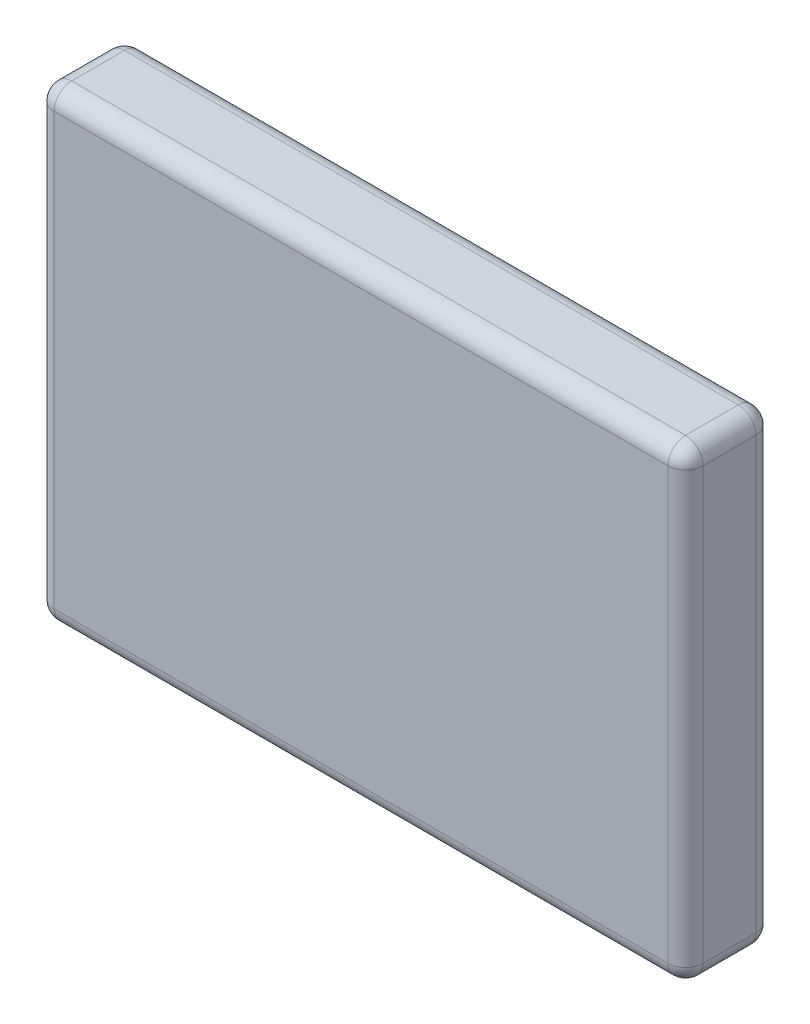
ISO-10303-21;
HEADER;
FILE_DESCRIPTION(('STEP AP214'),'2;1');
FILE_NAME('part.step','',(''),(''),'','','');
FILE_SCHEMA(('AUTOMOTIVE_DESIGN { 1 0 10303 214 1 1 1 1 }'));
ENDSEC;
DATA;
#1=APPLICATION_CONTEXT('core data for automotive mechanical design processes');
#2=APPLICATION_PROTOCOL_DEFINITION('international standard','automotive_design',2000,#1);
#3=PRODUCT_CONTEXT('',#1,'mechanical');
#4=PRODUCT('Part','Part','',(#3));
#5=PRODUCT_RELATED_PRODUCT_CATEGORY('part','',(#4));
#6=PRODUCT_DEFINITION_FORMATION('','',#4);
#7=PRODUCT_DEFINITION_CONTEXT('part definition',#1,'design');
#8=PRODUCT_DEFINITION('design','',#6,#7);
#9=PRODUCT_DEFINITION_SHAPE('','',#8);
#10=(LENGTH_UNIT() NAMED_UNIT(*) SI_UNIT(.MILLI.,.METRE.));
#11=(NAMED_UNIT(*) PLANE_ANGLE_UNIT() SI_UNIT($,.RADIAN.));
#12=(NAMED_UNIT(*) SI_UNIT($,.STERADIAN.) SOLID_ANGLE_UNIT());
#13=UNCERTAINTY_MEASURE_WITH_UNIT(LENGTH_MEASURE(1.E-05),#10,'distance_accuracy_value','');
#14=(GEOMETRIC_REPRESENTATION_CONTEXT(3) GLOBAL_UNCERTAINTY_ASSIGNED_CONTEXT((#13)) GLOBAL_UNIT_ASSIGNED_CONTEXT((#10,
#11,#12)) REPRESENTATION_CONTEXT('',''));
#15=CARTESIAN_POINT('',(0.,0.,0.));
#16=DIRECTION('',(0.,0.,1.));
#17=DIRECTION('',(1.,0.,0.));
#18=AXIS2_PLACEMENT_3D('',#15,#16,#17);
#19=CARTESIAN_POINT('',(0.,0.,5.));
#20=DIRECTION('',(1.,0.,0.));
#21=DIRECTION('',(0.,0.,-1.));
#22=AXIS2_PLACEMENT_3D('',#19,#20,#21);
#23=PLANE('',#22);
#24=DIRECTION('',(0.,-1.,0.));
#25=VECTOR('',#24,1.);
#26=CARTESIAN_POINT('',(0.,0.,1.));
#27=LINE('',#26,#25);
#28=CARTESIAN_POINT('',(0.,25.5,1.));
#29=VERTEX_POINT('',#28);
#30=CARTESIAN_POINT('',(0.,1.,1.));
#31=VERTEX_POINT('',#30);
#32=EDGE_CURVE('E303',#29,#31,#27,.T.);
#33=ORIENTED_EDGE('',*,*,#32,.T.);
#34=DIRECTION('',(0.,0.,-1.));
#35=VECTOR('',#34,1.);
#36=CARTESIAN_POINT('',(0.,1.,5.));
#37=LINE('',#36,#35);
#38=CARTESIAN_POINT('',(0.,1.,4.));
#39=VERTEX_POINT('',#38);
#40=EDGE_CURVE('E308',#31,#39,#37,.F.);
#41=ORIENTED_EDGE('',*,*,#40,.T.);
#42=DIRECTION('',(0.,-1.,0.));
#43=VECTOR('',#42,1.);
#44=CARTESIAN_POINT('',(0.,0.,4.));
#45=LINE('',#44,#43);
#46=CARTESIAN_POINT('',(0.,25.5,4.));
#47=VERTEX_POINT('',#46);
#48=EDGE_CURVE('E306',#39,#47,#45,.F.);
#49=ORIENTED_EDGE('',*,*,#48,.T.);
#50=DIRECTION('',(0.,0.,-1.));
#51=VECTOR('',#50,1.);
#52=CARTESIAN_POINT('',(0.,25.5,5.));
#53=LINE('',#52,#51);
#54=EDGE_CURVE('E297',#47,#29,#53,.T.);
#55=ORIENTED_EDGE('',*,*,#54,.T.);
#56=EDGE_LOOP('',(#33,#41,#49,#55));
#57=FACE_BOUND('',#56,.T.);
#58=ADVANCED_FACE('F45',(#57),#23,.F.);
#59=CARTESIAN_POINT('',(0.,0.,5.));
#60=DIRECTION('',(0.,1.,0.));
#61=DIRECTION('',(0.,0.,1.));
#62=AXIS2_PLACEMENT_3D('',#59,#60,#61);
#63=PLANE('',#62);
#64=DIRECTION('',(1.,0.,0.));
#65=VECTOR('',#64,1.);
#66=CARTESIAN_POINT('',(0.,0.,4.));
#67=LINE('',#66,#65);
#68=CARTESIAN_POINT('',(35.9,0.,4.));
#69=VERTEX_POINT('',#68);
#70=CARTESIAN_POINT('',(1.,0.,4.));
#71=VERTEX_POINT('',#70);
#72=EDGE_CURVE('E168',#69,#71,#67,.F.);
#73=ORIENTED_EDGE('',*,*,#72,.T.);
#74=DIRECTION('',(0.,0.,-1.));
#75=VECTOR('',#74,1.);
#76=CARTESIAN_POINT('',(1.,0.,5.));
#77=LINE('',#76,#75);
#78=CARTESIAN_POINT('',(1.,0.,1.));
#79=VERTEX_POINT('',#78);
#80=EDGE_CURVE('E256',#71,#79,#77,.T.);
#81=ORIENTED_EDGE('',*,*,#80,.T.);
#82=DIRECTION('',(1.,0.,0.));
#83=VECTOR('',#82,1.);
#84=CARTESIAN_POINT('',(36.9,0.,1.));
#85=LINE('',#84,#83);
#86=CARTESIAN_POINT('',(35.9,0.,1.));
#87=VERTEX_POINT('',#86);
#88=EDGE_CURVE('E333',#79,#87,#85,.T.);
#89=ORIENTED_EDGE('',*,*,#88,.T.);
#90=DIRECTION('',(0.,0.,-1.));
#91=VECTOR('',#90,1.);
#92=CARTESIAN_POINT('',(35.9,0.,5.));
#93=LINE('',#92,#91);
#94=EDGE_CURVE('E330',#87,#69,#93,.F.);
#95=ORIENTED_EDGE('',*,*,#94,.T.);
#96=EDGE_LOOP('',(#73,#81,#89,#95));
#97=FACE_BOUND('',#96,.T.);
#98=ADVANCED_FACE('F341',(#97),#63,.F.);
#99=CARTESIAN_POINT('',(36.9,0.,5.));
#100=DIRECTION('',(-1.,0.,0.));
#101=DIRECTION('',(0.,0.,1.));
#102=AXIS2_PLACEMENT_3D('',#99,#100,#101);
#103=PLANE('',#102);
#104=DIRECTION('',(0.,1.,0.));
#105=VECTOR('',#104,1.);
#106=CARTESIAN_POINT('',(36.9,0.,4.));
#107=LINE('',#106,#105);
#108=CARTESIAN_POINT('',(36.9,25.5,4.));
#109=VERTEX_POINT('',#108);
#110=CARTESIAN_POINT('',(36.9,1.,4.));
#111=VERTEX_POINT('',#110);
#112=EDGE_CURVE('E55',#109,#111,#107,.F.);
#113=ORIENTED_EDGE('',*,*,#112,.T.);
#114=DIRECTION('',(0.,0.,-1.));
#115=VECTOR('',#114,1.);
#116=CARTESIAN_POINT('',(36.9,1.,5.));
#117=LINE('',#116,#115);
#118=CARTESIAN_POINT('',(36.9,1.,1.));
#119=VERTEX_POINT('',#118);
#120=EDGE_CURVE('E11',#111,#119,#117,.T.);
#121=ORIENTED_EDGE('',*,*,#120,.T.);
#122=DIRECTION('',(0.,1.,0.));
#123=VECTOR('',#122,1.);
#124=CARTESIAN_POINT('',(36.9,26.5,1.));
#125=LINE('',#124,#123);
#126=CARTESIAN_POINT('',(36.9,25.5,1.));
#127=VERTEX_POINT('',#126);
#128=EDGE_CURVE('E263',#119,#127,#125,.T.);
#129=ORIENTED_EDGE('',*,*,#128,.T.);
#130=DIRECTION('',(0.,0.,-1.));
#131=VECTOR('',#130,1.);
#132=CARTESIAN_POINT('',(36.9,25.5,5.));
#133=LINE('',#132,#131);
#134=EDGE_CURVE('E66',#127,#109,#133,.F.);
#135=ORIENTED_EDGE('',*,*,#134,.T.);
#136=EDGE_LOOP('',(#113,#121,#129,#135));
#137=FACE_BOUND('',#136,.T.);
#138=ADVANCED_FACE('F381',(#137),#103,.F.);
#139=CARTESIAN_POINT('',(0.,26.5,5.));
#140=DIRECTION('',(0.,-1.,0.));
#141=DIRECTION('',(0.,0.,-1.));
#142=AXIS2_PLACEMENT_3D('',#139,#140,#141);
#143=PLANE('',#142);
#144=DIRECTION('',(0.,0.,-1.));
#145=VECTOR('',#144,1.);
#146=CARTESIAN_POINT('',(1.,26.5,5.));
#147=LINE('',#146,#145);
#148=CARTESIAN_POINT('',(1.,26.5,1.));
#149=VERTEX_POINT('',#148);
#150=CARTESIAN_POINT('',(1.,26.5,4.));
#151=VERTEX_POINT('',#150);
#152=EDGE_CURVE('E249',#149,#151,#147,.F.);
#153=ORIENTED_EDGE('',*,*,#152,.T.);
#154=DIRECTION('',(-1.,0.,0.));
#155=VECTOR('',#154,1.);
#156=CARTESIAN_POINT('',(0.,26.5,4.));
#157=LINE('',#156,#155);
#158=CARTESIAN_POINT('',(35.9,26.5,4.));
#159=VERTEX_POINT('',#158);
#160=EDGE_CURVE('E254',#151,#159,#157,.F.);
#161=ORIENTED_EDGE('',*,*,#160,.T.);
#162=DIRECTION('',(0.,0.,-1.));
#163=VECTOR('',#162,1.);
#164=CARTESIAN_POINT('',(35.9,26.5,5.));
#165=LINE('',#164,#163);
#166=CARTESIAN_POINT('',(35.9,26.5,1.));
#167=VERTEX_POINT('',#166);
#168=EDGE_CURVE('E250',#159,#167,#165,.T.);
#169=ORIENTED_EDGE('',*,*,#168,.T.);
#170=DIRECTION('',(-1.,0.,0.));
#171=VECTOR('',#170,1.);
#172=CARTESIAN_POINT('',(0.,26.5,1.));
#173=LINE('',#172,#171);
#174=EDGE_CURVE('E245',#167,#149,#173,.T.);
#175=ORIENTED_EDGE('',*,*,#174,.T.);
#176=EDGE_LOOP('',(#153,#161,#169,#175));
#177=FACE_BOUND('',#176,.T.);
#178=ADVANCED_FACE('F357',(#177),#143,.F.);
#179=CARTESIAN_POINT('',(0.,0.,5.));
#180=DIRECTION('',(0.,0.,-1.));
#181=DIRECTION('',(-1.,0.,0.));
#182=AXIS2_PLACEMENT_3D('',#179,#180,#181);
#183=PLANE('',#182);
#184=DIRECTION('',(-1.,0.,0.));
#185=VECTOR('',#184,1.);
#186=CARTESIAN_POINT('',(0.,25.5,5.));
#187=LINE('',#186,#185);
#188=CARTESIAN_POINT('',(35.9,25.5,5.));
#189=VERTEX_POINT('',#188);
#190=CARTESIAN_POINT('',(1.,25.5,5.));
#191=VERTEX_POINT('',#190);
#192=EDGE_CURVE('E145',#189,#191,#187,.T.);
#193=ORIENTED_EDGE('',*,*,#192,.T.);
#194=DIRECTION('',(0.,-1.,0.));
#195=VECTOR('',#194,1.);
#196=CARTESIAN_POINT('',(1.,0.,5.));
#197=LINE('',#196,#195);
#198=CARTESIAN_POINT('',(1.,1.,5.));
#199=VERTEX_POINT('',#198);
#200=EDGE_CURVE('E140',#191,#199,#197,.T.);
#201=ORIENTED_EDGE('',*,*,#200,.T.);
#202=DIRECTION('',(1.,0.,0.));
#203=VECTOR('',#202,1.);
#204=CARTESIAN_POINT('',(0.,1.,5.));
#205=LINE('',#204,#203);
#206=CARTESIAN_POINT('',(35.9,1.,5.));
#207=VERTEX_POINT('',#206);
#208=EDGE_CURVE('E134',#199,#207,#205,.T.);
#209=ORIENTED_EDGE('',*,*,#208,.T.);
#210=DIRECTION('',(0.,1.,0.));
#211=VECTOR('',#210,1.);
#212=CARTESIAN_POINT('',(35.9,0.,5.));
#213=LINE('',#212,#211);
#214=EDGE_CURVE('E137',#207,#189,#213,.T.);
#215=ORIENTED_EDGE('',*,*,#214,.T.);
#216=EDGE_LOOP('',(#193,#201,#209,#215));
#217=FACE_BOUND('',#216,.T.);
#218=ADVANCED_FACE('F136',(#217),#183,.F.);
#219=CARTESIAN_POINT('',(0.,0.,0.));
#220=DIRECTION('',(0.,0.,-1.));
#221=DIRECTION('',(-1.,0.,0.));
#222=AXIS2_PLACEMENT_3D('',#219,#220,#221);
#223=PLANE('',#222);
#224=DIRECTION('',(1.,0.,0.));
#225=VECTOR('',#224,1.);
#226=CARTESIAN_POINT('',(0.,1.,0.));
#227=LINE('',#226,#225);
#228=CARTESIAN_POINT('',(35.9,1.,0.));
#229=VERTEX_POINT('',#228);
#230=CARTESIAN_POINT('',(1.,1.,0.));
#231=VERTEX_POINT('',#230);
#232=EDGE_CURVE('E324',#229,#231,#227,.F.);
#233=ORIENTED_EDGE('',*,*,#232,.T.);
#234=DIRECTION('',(0.,-1.,0.));
#235=VECTOR('',#234,1.);
#236=CARTESIAN_POINT('',(1.,26.5,0.));
#237=LINE('',#236,#235);
#238=CARTESIAN_POINT('',(1.,25.5,0.));
#239=VERTEX_POINT('',#238);
#240=EDGE_CURVE('E327',#231,#239,#237,.F.);
#241=ORIENTED_EDGE('',*,*,#240,.T.);
#242=DIRECTION('',(-1.,0.,0.));
#243=VECTOR('',#242,1.);
#244=CARTESIAN_POINT('',(36.9,25.5,0.));
#245=LINE('',#244,#243);
#246=CARTESIAN_POINT('',(35.9,25.5,0.));
#247=VERTEX_POINT('',#246);
#248=EDGE_CURVE('E243',#239,#247,#245,.F.);
#249=ORIENTED_EDGE('',*,*,#248,.T.);
#250=DIRECTION('',(0.,1.,0.));
#251=VECTOR('',#250,1.);
#252=CARTESIAN_POINT('',(35.9,0.,0.));
#253=LINE('',#252,#251);
#254=EDGE_CURVE('E316',#247,#229,#253,.F.);
#255=ORIENTED_EDGE('',*,*,#254,.T.);
#256=EDGE_LOOP('',(#233,#241,#249,#255));
#257=FACE_BOUND('',#256,.T.);
#258=ADVANCED_FACE('F416',(#257),#223,.T.);
#259=CARTESIAN_POINT('',(35.9,0.,1.));
#260=DIRECTION('',(0.,-1.,0.));
#261=DIRECTION('',(0.,0.,-1.));
#262=AXIS2_PLACEMENT_3D('',#259,#260,#261);
#263=CYLINDRICAL_SURFACE('',#262,1.);
#264=CARTESIAN_POINT('',(35.9,25.5,1.));
#265=DIRECTION('',(0.,1.,0.));
#266=DIRECTION('',(0.,0.,1.));
#267=AXIS2_PLACEMENT_3D('',#264,#265,#266);
#268=CIRCLE('',#267,1.);
#269=EDGE_CURVE('E49',#127,#247,#268,.T.);
#270=ORIENTED_EDGE('',*,*,#269,.F.);
#271=ORIENTED_EDGE('',*,*,#128,.F.);
#272=CARTESIAN_POINT('',(35.9,1.,1.));
#273=DIRECTION('',(0.,-1.,0.));
#274=DIRECTION('',(0.,0.,-1.));
#275=AXIS2_PLACEMENT_3D('',#272,#273,#274);
#276=CIRCLE('',#275,1.);
#277=EDGE_CURVE('E221',#229,#119,#276,.T.);
#278=ORIENTED_EDGE('',*,*,#277,.F.);
#279=ORIENTED_EDGE('',*,*,#254,.F.);
#280=EDGE_LOOP('',(#270,#271,#278,#279));
#281=FACE_BOUND('',#280,.T.);
#282=ADVANCED_FACE('F47',(#281),#263,.T.);
#283=CARTESIAN_POINT('',(35.9,25.5,1.));
#284=DIRECTION('',(0.,0.,-1.));
#285=DIRECTION('',(-1.,0.,0.));
#286=AXIS2_PLACEMENT_3D('',#283,#284,#285);
#287=SPHERICAL_SURFACE('',#286,1.);
#288=CARTESIAN_POINT('',(35.9,25.5,1.));
#289=DIRECTION('',(0.,0.,-1.));
#290=DIRECTION('',(-1.,0.,0.));
#291=AXIS2_PLACEMENT_3D('',#288,#289,#290);
#292=CIRCLE('',#291,1.);
#293=EDGE_CURVE('E214',#127,#167,#292,.F.);
#294=ORIENTED_EDGE('',*,*,#293,.F.);
#295=ORIENTED_EDGE('',*,*,#269,.T.);
#296=CARTESIAN_POINT('',(35.9,25.5,1.));
#297=DIRECTION('',(1.,0.,0.));
#298=DIRECTION('',(0.,0.,-1.));
#299=AXIS2_PLACEMENT_3D('',#296,#297,#298);
#300=CIRCLE('',#299,1.);
#301=EDGE_CURVE('E218',#167,#247,#300,.F.);
#302=ORIENTED_EDGE('',*,*,#301,.F.);
#303=EDGE_LOOP('',(#294,#295,#302));
#304=FACE_BOUND('',#303,.T.);
#305=ADVANCED_FACE('F235',(#304),#287,.T.);
#306=CARTESIAN_POINT('',(35.9,1.,1.));
#307=DIRECTION('',(1.,0.,0.));
#308=DIRECTION('',(0.,0.,-1.));
#309=AXIS2_PLACEMENT_3D('',#306,#307,#308);
#310=SPHERICAL_SURFACE('',#309,1.);
#311=CARTESIAN_POINT('',(35.9,1.,1.));
#312=DIRECTION('',(1.,0.,0.));
#313=DIRECTION('',(0.,0.,-1.));
#314=AXIS2_PLACEMENT_3D('',#311,#312,#313);
#315=CIRCLE('',#314,1.);
#316=EDGE_CURVE('E207',#229,#87,#315,.F.);
#317=ORIENTED_EDGE('',*,*,#316,.F.);
#318=ORIENTED_EDGE('',*,*,#277,.T.);
#319=CARTESIAN_POINT('',(35.9,1.,1.));
#320=DIRECTION('',(0.,0.,-1.));
#321=DIRECTION('',(-1.,0.,0.));
#322=AXIS2_PLACEMENT_3D('',#319,#320,#321);
#323=CIRCLE('',#322,1.);
#324=EDGE_CURVE('E211',#87,#119,#323,.F.);
#325=ORIENTED_EDGE('',*,*,#324,.F.);
#326=EDGE_LOOP('',(#317,#318,#325));
#327=FACE_BOUND('',#326,.T.);
#328=ADVANCED_FACE('F413',(#327),#310,.T.);
#329=CARTESIAN_POINT('',(0.,25.5,1.));
#330=DIRECTION('',(1.,0.,0.));
#331=DIRECTION('',(0.,0.,-1.));
#332=AXIS2_PLACEMENT_3D('',#329,#330,#331);
#333=CYLINDRICAL_SURFACE('',#332,1.);
#334=ORIENTED_EDGE('',*,*,#301,.T.);
#335=ORIENTED_EDGE('',*,*,#248,.F.);
#336=CARTESIAN_POINT('',(1.,25.5,1.));
#337=DIRECTION('',(-1.,0.,0.));
#338=DIRECTION('',(0.,0.,1.));
#339=AXIS2_PLACEMENT_3D('',#336,#337,#338);
#340=CIRCLE('',#339,1.);
#341=EDGE_CURVE('E200',#149,#239,#340,.T.);
#342=ORIENTED_EDGE('',*,*,#341,.F.);
#343=ORIENTED_EDGE('',*,*,#174,.F.);
#344=EDGE_LOOP('',(#334,#335,#342,#343));
#345=FACE_BOUND('',#344,.T.);
#346=ADVANCED_FACE('F241',(#345),#333,.T.);
#347=CARTESIAN_POINT('',(35.9,25.5,5.));
#348=DIRECTION('',(0.,0.,-1.));
#349=DIRECTION('',(-1.,0.,0.));
#350=AXIS2_PLACEMENT_3D('',#347,#348,#349);
#351=CYLINDRICAL_SURFACE('',#350,1.);
#352=ORIENTED_EDGE('',*,*,#293,.T.);
#353=ORIENTED_EDGE('',*,*,#168,.F.);
#354=CARTESIAN_POINT('',(35.9,25.5,4.));
#355=DIRECTION('',(0.,0.,1.));
#356=DIRECTION('',(1.,0.,0.));
#357=AXIS2_PLACEMENT_3D('',#354,#355,#356);
#358=CIRCLE('',#357,1.);
#359=EDGE_CURVE('E196',#109,#159,#358,.T.);
#360=ORIENTED_EDGE('',*,*,#359,.F.);
#361=ORIENTED_EDGE('',*,*,#134,.F.);
#362=EDGE_LOOP('',(#352,#353,#360,#361));
#363=FACE_BOUND('',#362,.T.);
#364=ADVANCED_FACE('F361',(#363),#351,.T.);
#365=CARTESIAN_POINT('',(35.9,0.,4.));
#366=DIRECTION('',(0.,1.,0.));
#367=DIRECTION('',(0.,0.,1.));
#368=AXIS2_PLACEMENT_3D('',#365,#366,#367);
#369=CYLINDRICAL_SURFACE('',#368,1.);
#370=CARTESIAN_POINT('',(35.9,1.,4.));
#371=DIRECTION('',(0.,-1.,0.));
#372=DIRECTION('',(0.,0.,-1.));
#373=AXIS2_PLACEMENT_3D('',#370,#371,#372);
#374=CIRCLE('',#373,1.);
#375=EDGE_CURVE('E151',#111,#207,#374,.T.);
#376=ORIENTED_EDGE('',*,*,#375,.F.);
#377=ORIENTED_EDGE('',*,*,#112,.F.);
#378=CARTESIAN_POINT('',(35.9,25.5,4.));
#379=DIRECTION('',(0.,1.,0.));
#380=DIRECTION('',(0.,0.,1.));
#381=AXIS2_PLACEMENT_3D('',#378,#379,#380);
#382=CIRCLE('',#381,1.);
#383=EDGE_CURVE('E154',#189,#109,#382,.T.);
#384=ORIENTED_EDGE('',*,*,#383,.F.);
#385=ORIENTED_EDGE('',*,*,#214,.F.);
#386=EDGE_LOOP('',(#376,#377,#384,#385));
#387=FACE_BOUND('',#386,.T.);
#388=ADVANCED_FACE('F150',(#387),#369,.T.);
#389=CARTESIAN_POINT('',(35.9,1.,5.));
#390=DIRECTION('',(0.,0.,-1.));
#391=DIRECTION('',(-1.,0.,0.));
#392=AXIS2_PLACEMENT_3D('',#389,#390,#391);
#393=CYLINDRICAL_SURFACE('',#392,1.);
#394=ORIENTED_EDGE('',*,*,#324,.T.);
#395=ORIENTED_EDGE('',*,*,#120,.F.);
#396=CARTESIAN_POINT('',(35.9,1.,4.));
#397=DIRECTION('',(0.,0.,1.));
#398=DIRECTION('',(1.,0.,0.));
#399=AXIS2_PLACEMENT_3D('',#396,#397,#398);
#400=CIRCLE('',#399,1.);
#401=EDGE_CURVE('E164',#69,#111,#400,.T.);
#402=ORIENTED_EDGE('',*,*,#401,.F.);
#403=ORIENTED_EDGE('',*,*,#94,.F.);
#404=EDGE_LOOP('',(#394,#395,#402,#403));
#405=FACE_BOUND('',#404,.T.);
#406=ADVANCED_FACE('F415',(#405),#393,.T.);
#407=CARTESIAN_POINT('',(0.,1.,1.));
#408=DIRECTION('',(-1.,0.,0.));
#409=DIRECTION('',(0.,0.,1.));
#410=AXIS2_PLACEMENT_3D('',#407,#408,#409);
#411=CYLINDRICAL_SURFACE('',#410,1.);
#412=ORIENTED_EDGE('',*,*,#316,.T.);
#413=ORIENTED_EDGE('',*,*,#88,.F.);
#414=CARTESIAN_POINT('',(1.,1.,1.));
#415=DIRECTION('',(-1.,0.,0.));
#416=DIRECTION('',(0.,0.,1.));
#417=AXIS2_PLACEMENT_3D('',#414,#415,#416);
#418=CIRCLE('',#417,1.);
#419=EDGE_CURVE('E188',#231,#79,#418,.T.);
#420=ORIENTED_EDGE('',*,*,#419,.F.);
#421=ORIENTED_EDGE('',*,*,#232,.F.);
#422=EDGE_LOOP('',(#412,#413,#420,#421));
#423=FACE_BOUND('',#422,.T.);
#424=ADVANCED_FACE('F411',(#423),#411,.T.);
#425=CARTESIAN_POINT('',(1.,0.,1.));
#426=DIRECTION('',(0.,1.,0.));
#427=DIRECTION('',(0.,0.,1.));
#428=AXIS2_PLACEMENT_3D('',#425,#426,#427);
#429=CYLINDRICAL_SURFACE('',#428,1.);
#430=CARTESIAN_POINT('',(1.,25.5,1.));
#431=DIRECTION('',(0.,1.,0.));
#432=DIRECTION('',(0.,0.,1.));
#433=AXIS2_PLACEMENT_3D('',#430,#431,#432);
#434=CIRCLE('',#433,1.);
#435=EDGE_CURVE('E203',#239,#29,#434,.T.);
#436=ORIENTED_EDGE('',*,*,#435,.F.);
#437=ORIENTED_EDGE('',*,*,#240,.F.);
#438=CARTESIAN_POINT('',(1.,1.,1.));
#439=DIRECTION('',(0.,-1.,0.));
#440=DIRECTION('',(0.,0.,-1.));
#441=AXIS2_PLACEMENT_3D('',#438,#439,#440);
#442=CIRCLE('',#441,1.);
#443=EDGE_CURVE('E184',#31,#231,#442,.T.);
#444=ORIENTED_EDGE('',*,*,#443,.F.);
#445=ORIENTED_EDGE('',*,*,#32,.F.);
#446=EDGE_LOOP('',(#436,#437,#444,#445));
#447=FACE_BOUND('',#446,.T.);
#448=ADVANCED_FACE('F373',(#447),#429,.T.);
#449=CARTESIAN_POINT('',(1.,25.5,1.));
#450=DIRECTION('',(0.,0.,-1.));
#451=DIRECTION('',(-1.,0.,0.));
#452=AXIS2_PLACEMENT_3D('',#449,#450,#451);
#453=SPHERICAL_SURFACE('',#452,1.);
#454=ORIENTED_EDGE('',*,*,#341,.T.);
#455=ORIENTED_EDGE('',*,*,#435,.T.);
#456=CARTESIAN_POINT('',(1.,25.5,1.));
#457=DIRECTION('',(0.,0.,-1.));
#458=DIRECTION('',(-1.,0.,0.));
#459=AXIS2_PLACEMENT_3D('',#456,#457,#458);
#460=CIRCLE('',#459,1.);
#461=EDGE_CURVE('E175',#149,#29,#460,.F.);
#462=ORIENTED_EDGE('',*,*,#461,.F.);
#463=EDGE_LOOP('',(#454,#455,#462));
#464=FACE_BOUND('',#463,.T.);
#465=ADVANCED_FACE('F365',(#464),#453,.T.);
#466=CARTESIAN_POINT('',(35.9,25.5,4.));
#467=DIRECTION('',(1.,0.,0.));
#468=DIRECTION('',(0.,0.,-1.));
#469=AXIS2_PLACEMENT_3D('',#466,#467,#468);
#470=SPHERICAL_SURFACE('',#469,1.);
#471=ORIENTED_EDGE('',*,*,#383,.T.);
#472=ORIENTED_EDGE('',*,*,#359,.T.);
#473=CARTESIAN_POINT('',(35.9,25.5,4.));
#474=DIRECTION('',(1.,0.,0.));
#475=DIRECTION('',(0.,0.,-1.));
#476=AXIS2_PLACEMENT_3D('',#473,#474,#475);
#477=CIRCLE('',#476,1.);
#478=EDGE_CURVE('E170',#189,#159,#477,.F.);
#479=ORIENTED_EDGE('',*,*,#478,.F.);
#480=EDGE_LOOP('',(#471,#472,#479));
#481=FACE_BOUND('',#480,.T.);
#482=ADVANCED_FACE('F363',(#481),#470,.T.);
#483=CARTESIAN_POINT('',(35.9,1.,4.));
#484=DIRECTION('',(1.,0.,0.));
#485=DIRECTION('',(0.,0.,-1.));
#486=AXIS2_PLACEMENT_3D('',#483,#484,#485);
#487=SPHERICAL_SURFACE('',#486,1.);
#488=ORIENTED_EDGE('',*,*,#401,.T.);
#489=ORIENTED_EDGE('',*,*,#375,.T.);
#490=CARTESIAN_POINT('',(35.9,1.,4.));
#491=DIRECTION('',(1.,0.,0.));
#492=DIRECTION('',(0.,0.,-1.));
#493=AXIS2_PLACEMENT_3D('',#490,#491,#492);
#494=CIRCLE('',#493,1.);
#495=EDGE_CURVE('E161',#69,#207,#494,.F.);
#496=ORIENTED_EDGE('',*,*,#495,.F.);
#497=EDGE_LOOP('',(#488,#489,#496));
#498=FACE_BOUND('',#497,.T.);
#499=ADVANCED_FACE('F160',(#498),#487,.T.);
#500=CARTESIAN_POINT('',(1.,1.,1.));
#501=DIRECTION('',(0.,0.,-1.));
#502=DIRECTION('',(-1.,0.,0.));
#503=AXIS2_PLACEMENT_3D('',#500,#501,#502);
#504=SPHERICAL_SURFACE('',#503,1.);
#505=ORIENTED_EDGE('',*,*,#443,.T.);
#506=ORIENTED_EDGE('',*,*,#419,.T.);
#507=CARTESIAN_POINT('',(1.,1.,1.));
#508=DIRECTION('',(0.,0.,-1.));
#509=DIRECTION('',(-1.,0.,0.));
#510=AXIS2_PLACEMENT_3D('',#507,#508,#509);
#511=CIRCLE('',#510,1.);
#512=EDGE_CURVE('E171',#31,#79,#511,.F.);
#513=ORIENTED_EDGE('',*,*,#512,.F.);
#514=EDGE_LOOP('',(#505,#506,#513));
#515=FACE_BOUND('',#514,.T.);
#516=ADVANCED_FACE('F371',(#515),#504,.T.);
#517=CARTESIAN_POINT('',(1.,25.5,5.));
#518=DIRECTION('',(0.,0.,-1.));
#519=DIRECTION('',(-1.,0.,0.));
#520=AXIS2_PLACEMENT_3D('',#517,#518,#519);
#521=CYLINDRICAL_SURFACE('',#520,1.);
#522=ORIENTED_EDGE('',*,*,#461,.T.);
#523=ORIENTED_EDGE('',*,*,#54,.F.);
#524=CARTESIAN_POINT('',(1.,25.5,4.));
#525=DIRECTION('',(0.,0.,1.));
#526=DIRECTION('',(1.,0.,0.));
#527=AXIS2_PLACEMENT_3D('',#524,#525,#526);
#528=CIRCLE('',#527,1.);
#529=EDGE_CURVE('E177',#151,#47,#528,.T.);
#530=ORIENTED_EDGE('',*,*,#529,.F.);
#531=ORIENTED_EDGE('',*,*,#152,.F.);
#532=EDGE_LOOP('',(#522,#523,#530,#531));
#533=FACE_BOUND('',#532,.T.);
#534=ADVANCED_FACE('F299',(#533),#521,.T.);
#535=CARTESIAN_POINT('',(0.,25.5,4.));
#536=DIRECTION('',(-1.,0.,0.));
#537=DIRECTION('',(0.,0.,1.));
#538=AXIS2_PLACEMENT_3D('',#535,#536,#537);
#539=CYLINDRICAL_SURFACE('',#538,1.);
#540=ORIENTED_EDGE('',*,*,#478,.T.);
#541=ORIENTED_EDGE('',*,*,#160,.F.);
#542=CARTESIAN_POINT('',(1.,25.5,4.));
#543=DIRECTION('',(-1.,0.,0.));
#544=DIRECTION('',(0.,0.,1.));
#545=AXIS2_PLACEMENT_3D('',#542,#543,#544);
#546=CIRCLE('',#545,1.);
#547=EDGE_CURVE('E284',#191,#151,#546,.T.);
#548=ORIENTED_EDGE('',*,*,#547,.F.);
#549=ORIENTED_EDGE('',*,*,#192,.F.);
#550=EDGE_LOOP('',(#540,#541,#548,#549));
#551=FACE_BOUND('',#550,.T.);
#552=ADVANCED_FACE('F356',(#551),#539,.T.);
#553=CARTESIAN_POINT('',(0.,1.,4.));
#554=DIRECTION('',(1.,0.,0.));
#555=DIRECTION('',(0.,0.,-1.));
#556=AXIS2_PLACEMENT_3D('',#553,#554,#555);
#557=CYLINDRICAL_SURFACE('',#556,1.);
#558=ORIENTED_EDGE('',*,*,#495,.T.);
#559=ORIENTED_EDGE('',*,*,#208,.F.);
#560=CARTESIAN_POINT('',(1.,1.,4.));
#561=DIRECTION('',(-1.,0.,0.));
#562=DIRECTION('',(0.,0.,1.));
#563=AXIS2_PLACEMENT_3D('',#560,#561,#562);
#564=CIRCLE('',#563,1.);
#565=EDGE_CURVE('E280',#71,#199,#564,.T.);
#566=ORIENTED_EDGE('',*,*,#565,.F.);
#567=ORIENTED_EDGE('',*,*,#72,.F.);
#568=EDGE_LOOP('',(#558,#559,#566,#567));
#569=FACE_BOUND('',#568,.T.);
#570=ADVANCED_FACE('F167',(#569),#557,.T.);
#571=CARTESIAN_POINT('',(1.,1.,5.));
#572=DIRECTION('',(0.,0.,-1.));
#573=DIRECTION('',(-1.,0.,0.));
#574=AXIS2_PLACEMENT_3D('',#571,#572,#573);
#575=CYLINDRICAL_SURFACE('',#574,1.);
#576=ORIENTED_EDGE('',*,*,#512,.T.);
#577=ORIENTED_EDGE('',*,*,#80,.F.);
#578=CARTESIAN_POINT('',(1.,1.,4.));
#579=DIRECTION('',(0.,0.,1.));
#580=DIRECTION('',(1.,0.,0.));
#581=AXIS2_PLACEMENT_3D('',#578,#579,#580);
#582=CIRCLE('',#581,1.);
#583=EDGE_CURVE('E276',#39,#71,#582,.T.);
#584=ORIENTED_EDGE('',*,*,#583,.F.);
#585=ORIENTED_EDGE('',*,*,#40,.F.);
#586=EDGE_LOOP('',(#576,#577,#584,#585));
#587=FACE_BOUND('',#586,.T.);
#588=ADVANCED_FACE('F344',(#587),#575,.T.);
#589=CARTESIAN_POINT('',(1.,25.5,4.));
#590=DIRECTION('',(0.,1.,0.));
#591=DIRECTION('',(0.,0.,1.));
#592=AXIS2_PLACEMENT_3D('',#589,#590,#591);
#593=SPHERICAL_SURFACE('',#592,1.);
#594=ORIENTED_EDGE('',*,*,#547,.T.);
#595=ORIENTED_EDGE('',*,*,#529,.T.);
#596=CARTESIAN_POINT('',(1.,25.5,4.));
#597=DIRECTION('',(0.,1.,0.));
#598=DIRECTION('',(0.,0.,1.));
#599=AXIS2_PLACEMENT_3D('',#596,#597,#598);
#600=CIRCLE('',#599,1.);
#601=EDGE_CURVE('E273',#191,#47,#600,.F.);
#602=ORIENTED_EDGE('',*,*,#601,.F.);
#603=EDGE_LOOP('',(#594,#595,#602));
#604=FACE_BOUND('',#603,.T.);
#605=ADVANCED_FACE('F293',(#604),#593,.T.);
#606=CARTESIAN_POINT('',(1.,1.,4.));
#607=DIRECTION('',(0.,-1.,0.));
#608=DIRECTION('',(0.,0.,-1.));
#609=AXIS2_PLACEMENT_3D('',#606,#607,#608);
#610=SPHERICAL_SURFACE('',#609,1.);
#611=ORIENTED_EDGE('',*,*,#583,.T.);
#612=ORIENTED_EDGE('',*,*,#565,.T.);
#613=CARTESIAN_POINT('',(1.,1.,4.));
#614=DIRECTION('',(0.,-1.,0.));
#615=DIRECTION('',(0.,0.,-1.));
#616=AXIS2_PLACEMENT_3D('',#613,#614,#615);
#617=CIRCLE('',#616,1.);
#618=EDGE_CURVE('E270',#39,#199,#617,.F.);
#619=ORIENTED_EDGE('',*,*,#618,.F.);
#620=EDGE_LOOP('',(#611,#612,#619));
#621=FACE_BOUND('',#620,.T.);
#622=ADVANCED_FACE('F347',(#621),#610,.T.);
#623=CARTESIAN_POINT('',(1.,0.,4.));
#624=DIRECTION('',(0.,-1.,0.));
#625=DIRECTION('',(0.,0.,-1.));
#626=AXIS2_PLACEMENT_3D('',#623,#624,#625);
#627=CYLINDRICAL_SURFACE('',#626,1.);
#628=ORIENTED_EDGE('',*,*,#601,.T.);
#629=ORIENTED_EDGE('',*,*,#48,.F.);
#630=ORIENTED_EDGE('',*,*,#618,.T.);
#631=ORIENTED_EDGE('',*,*,#200,.F.);
#632=EDGE_LOOP('',(#628,#629,#630,#631));
#633=FACE_BOUND('',#632,.T.);
#634=ADVANCED_FACE('F348',(#633),#627,.T.);
#635=CLOSED_SHELL('',(#58,#98,#138,#178,#218,#258,#282,#305,#328,#346,#364,#388,#406,#424,#448,
#465,#482,#499,#516,#534,#552,#570,#588,#605,#622,#634));
#636=MANIFOLD_SOLID_BREP('B2',#635);
#637=ADVANCED_BREP_SHAPE_REPRESENTATION('',(#18,#636),#14);
#638=SHAPE_DEFINITION_REPRESENTATION(#9,#637);
ENDSEC;
END-ISO-10303-21;
